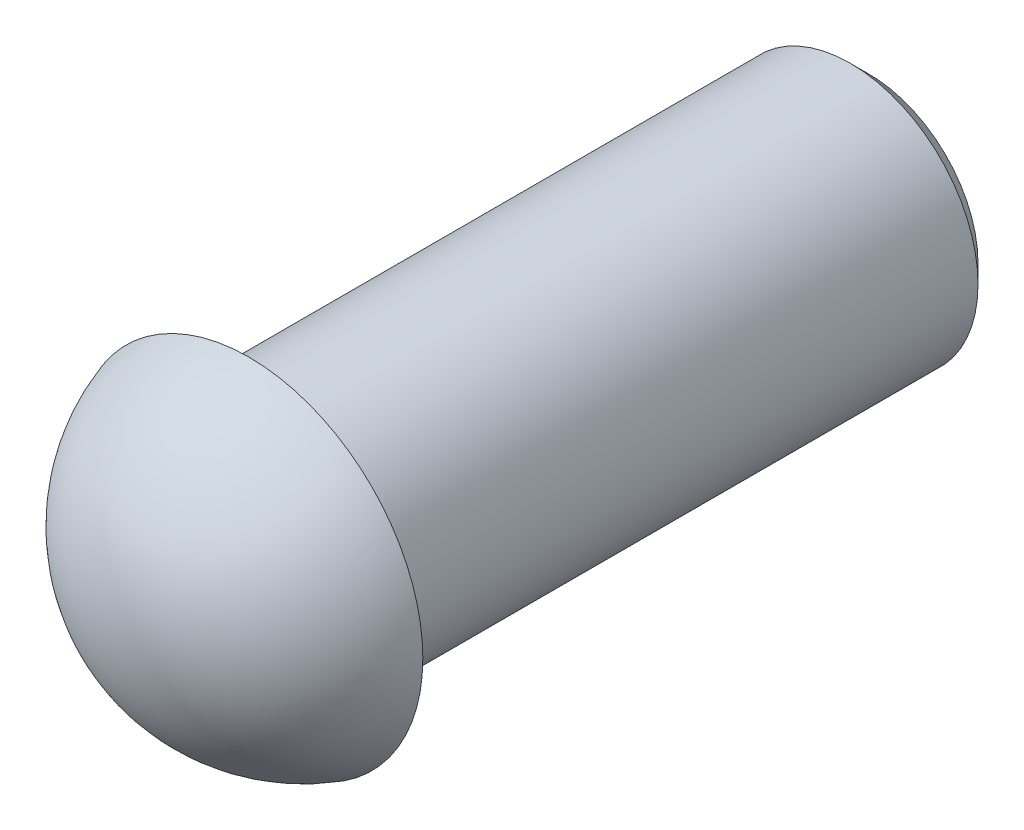
ISO-10303-21;
HEADER;
FILE_DESCRIPTION(('STEP AP214'),'2;1');
FILE_NAME('part.step','',(''),(''),'','','');
FILE_SCHEMA(('AUTOMOTIVE_DESIGN { 1 0 10303 214 1 1 1 1 }'));
ENDSEC;
DATA;
#1=APPLICATION_CONTEXT('core data for automotive mechanical design processes');
#2=APPLICATION_PROTOCOL_DEFINITION('international standard','automotive_design',2000,#1);
#3=PRODUCT_CONTEXT('',#1,'mechanical');
#4=PRODUCT('Part','Part','',(#3));
#5=PRODUCT_RELATED_PRODUCT_CATEGORY('part','',(#4));
#6=PRODUCT_DEFINITION_FORMATION('','',#4);
#7=PRODUCT_DEFINITION_CONTEXT('part definition',#1,'design');
#8=PRODUCT_DEFINITION('design','',#6,#7);
#9=PRODUCT_DEFINITION_SHAPE('','',#8);
#10=(LENGTH_UNIT() NAMED_UNIT(*) SI_UNIT(.MILLI.,.METRE.));
#11=(NAMED_UNIT(*) PLANE_ANGLE_UNIT() SI_UNIT($,.RADIAN.));
#12=(NAMED_UNIT(*) SI_UNIT($,.STERADIAN.) SOLID_ANGLE_UNIT());
#13=UNCERTAINTY_MEASURE_WITH_UNIT(LENGTH_MEASURE(1.E-05),#10,'distance_accuracy_value','');
#14=(GEOMETRIC_REPRESENTATION_CONTEXT(3) GLOBAL_UNCERTAINTY_ASSIGNED_CONTEXT((#13)) GLOBAL_UNIT_ASSIGNED_CONTEXT((#10,
#11,#12)) REPRESENTATION_CONTEXT('',''));
#15=CARTESIAN_POINT('',(0.,0.,0.));
#16=DIRECTION('',(0.,0.,1.));
#17=DIRECTION('',(1.,0.,0.));
#18=AXIS2_PLACEMENT_3D('',#15,#16,#17);
#19=CARTESIAN_POINT('',(0.,0.,-17.));
#20=DIRECTION('',(0.,0.,1.));
#21=DIRECTION('',(1.,0.,0.));
#22=AXIS2_PLACEMENT_3D('',#19,#20,#21);
#23=CYLINDRICAL_SURFACE('',#22,3.5);
#24=CARTESIAN_POINT('',(0.,0.,-16.5));
#25=DIRECTION('',(0.,0.,1.));
#26=DIRECTION('',(1.,0.,0.));
#27=AXIS2_PLACEMENT_3D('',#24,#25,#26);
#28=CIRCLE('',#27,3.5);
#29=CARTESIAN_POINT('',(3.5,0.,-16.5));
#30=VERTEX_POINT('',#29);
#31=EDGE_CURVE('E48',#30,#30,#28,.T.);
#32=ORIENTED_EDGE('',*,*,#31,.T.);
#33=EDGE_LOOP('',(#32));
#34=FACE_BOUND('',#33,.T.);
#35=CARTESIAN_POINT('',(0.,0.,0.));
#36=DIRECTION('',(0.,0.,1.));
#37=DIRECTION('',(1.,0.,0.));
#38=AXIS2_PLACEMENT_3D('',#35,#36,#37);
#39=CIRCLE('',#38,3.5);
#40=CARTESIAN_POINT('',(3.5,0.,0.));
#41=VERTEX_POINT('',#40);
#42=EDGE_CURVE('E52',#41,#41,#39,.T.);
#43=ORIENTED_EDGE('',*,*,#42,.F.);
#44=EDGE_LOOP('',(#43));
#45=FACE_BOUND('',#44,.T.);
#46=ADVANCED_FACE('F41',(#34,#45),#23,.T.);
#47=CARTESIAN_POINT('',(0.,0.,-17.));
#48=DIRECTION('',(0.,0.,1.));
#49=DIRECTION('',(1.,0.,0.));
#50=AXIS2_PLACEMENT_3D('',#47,#48,#49);
#51=PLANE('',#50);
#52=CARTESIAN_POINT('',(0.,0.,-17.));
#53=DIRECTION('',(0.,0.,1.));
#54=DIRECTION('',(1.,0.,0.));
#55=AXIS2_PLACEMENT_3D('',#52,#53,#54);
#56=CIRCLE('',#55,3.);
#57=CARTESIAN_POINT('',(3.,0.,-17.));
#58=VERTEX_POINT('',#57);
#59=EDGE_CURVE('E12',#58,#58,#56,.F.);
#60=ORIENTED_EDGE('',*,*,#59,.T.);
#61=EDGE_LOOP('',(#60));
#62=FACE_BOUND('',#61,.T.);
#63=ADVANCED_FACE('F66',(#62),#51,.F.);
#64=CARTESIAN_POINT('',(0.,0.,0.));
#65=DIRECTION('',(0.,0.,1.));
#66=DIRECTION('',(1.,0.,0.));
#67=AXIS2_PLACEMENT_3D('',#64,#65,#66);
#68=PLANE('',#67);
#69=ORIENTED_EDGE('',*,*,#42,.T.);
#70=EDGE_LOOP('',(#69));
#71=FACE_BOUND('',#70,.T.);
#72=CARTESIAN_POINT('',(0.,0.,0.));
#73=DIRECTION('',(0.,0.,1.));
#74=DIRECTION('',(1.,0.,0.));
#75=AXIS2_PLACEMENT_3D('',#72,#73,#74);
#76=CIRCLE('',#75,4.76969600708473);
#77=CARTESIAN_POINT('',(4.76969600708473,0.,0.));
#78=VERTEX_POINT('',#77);
#79=EDGE_CURVE('E56',#78,#78,#76,.T.);
#80=ORIENTED_EDGE('',*,*,#79,.F.);
#81=EDGE_LOOP('',(#80));
#82=FACE_BOUND('',#81,.T.);
#83=ADVANCED_FACE('F64',(#71,#82),#68,.F.);
#84=CARTESIAN_POINT('',(0.,0.,-1.5));
#85=DIRECTION('',(0.,0.,1.));
#86=DIRECTION('',(0.,1.,0.));
#87=AXIS2_PLACEMENT_3D('',#84,#85,#86);
#88=SPHERICAL_SURFACE('',#87,5.);
#89=ORIENTED_EDGE('',*,*,#79,.T.);
#90=EDGE_LOOP('',(#89));
#91=FACE_BOUND('',#90,.T.);
#92=ADVANCED_FACE('F62',(#91),#88,.T.);
#93=CARTESIAN_POINT('',(0.,0.,-16.5));
#94=DIRECTION('',(0.,0.,1.));
#95=DIRECTION('',(1.,0.,0.));
#96=AXIS2_PLACEMENT_3D('',#93,#94,#95);
#97=CONICAL_SURFACE('',#96,3.5,0.785398163397454);
#98=ORIENTED_EDGE('',*,*,#59,.F.);
#99=EDGE_LOOP('',(#98));
#100=FACE_BOUND('',#99,.T.);
#101=ORIENTED_EDGE('',*,*,#31,.F.);
#102=EDGE_LOOP('',(#101));
#103=FACE_BOUND('',#102,.T.);
#104=ADVANCED_FACE('F43',(#100,#103),#97,.T.);
#105=CLOSED_SHELL('',(#46,#63,#83,#92,#104));
#106=MANIFOLD_SOLID_BREP('B2',#105);
#107=ADVANCED_BREP_SHAPE_REPRESENTATION('',(#18,#106),#14);
#108=SHAPE_DEFINITION_REPRESENTATION(#9,#107);
ENDSEC;
END-ISO-10303-21;
